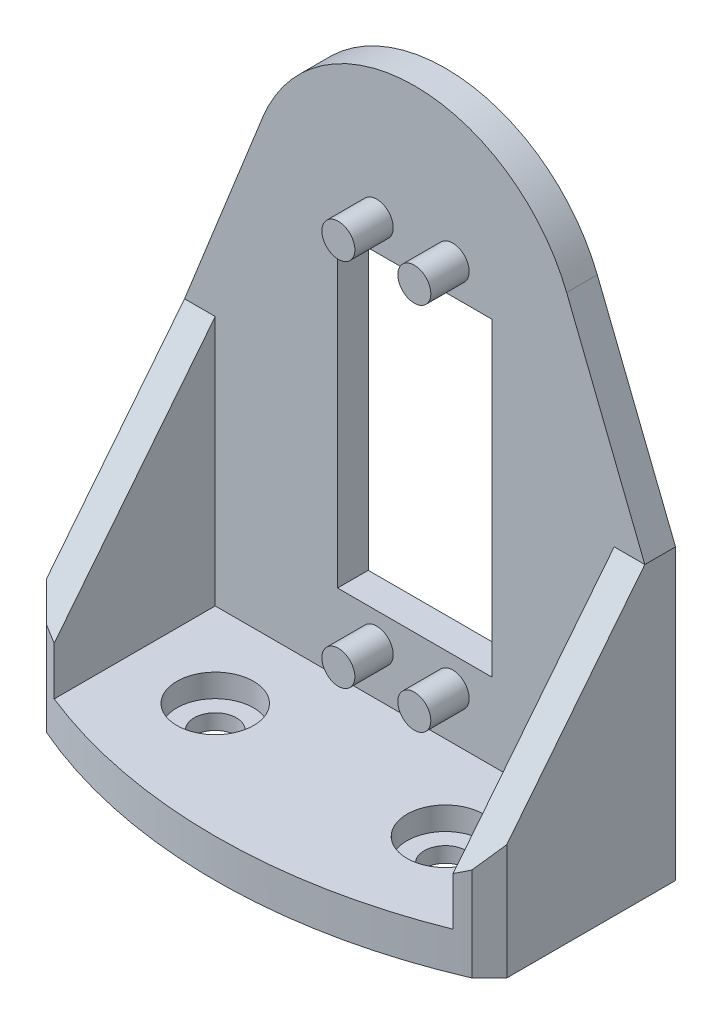
ISO-10303-21;
HEADER;
FILE_DESCRIPTION(('STEP AP214'),'2;1');
FILE_NAME('part.step','',(''),(''),'','','');
FILE_SCHEMA(('AUTOMOTIVE_DESIGN { 1 0 10303 214 1 1 1 1 }'));
ENDSEC;
DATA;
#1=APPLICATION_CONTEXT('core data for automotive mechanical design processes');
#2=APPLICATION_PROTOCOL_DEFINITION('international standard','automotive_design',2000,#1);
#3=PRODUCT_CONTEXT('',#1,'mechanical');
#4=PRODUCT('Part','Part','',(#3));
#5=PRODUCT_RELATED_PRODUCT_CATEGORY('part','',(#4));
#6=PRODUCT_DEFINITION_FORMATION('','',#4);
#7=PRODUCT_DEFINITION_CONTEXT('part definition',#1,'design');
#8=PRODUCT_DEFINITION('design','',#6,#7);
#9=PRODUCT_DEFINITION_SHAPE('','',#8);
#10=(LENGTH_UNIT() NAMED_UNIT(*) SI_UNIT(.MILLI.,.METRE.));
#11=(NAMED_UNIT(*) PLANE_ANGLE_UNIT() SI_UNIT($,.RADIAN.));
#12=(NAMED_UNIT(*) SI_UNIT($,.STERADIAN.) SOLID_ANGLE_UNIT());
#13=UNCERTAINTY_MEASURE_WITH_UNIT(LENGTH_MEASURE(1.E-05),#10,'distance_accuracy_value','');
#14=(GEOMETRIC_REPRESENTATION_CONTEXT(3) GLOBAL_UNCERTAINTY_ASSIGNED_CONTEXT((#13)) GLOBAL_UNIT_ASSIGNED_CONTEXT((#10,
#11,#12)) REPRESENTATION_CONTEXT('',''));
#15=CARTESIAN_POINT('',(0.,0.,0.));
#16=DIRECTION('',(0.,0.,1.));
#17=DIRECTION('',(1.,0.,0.));
#18=AXIS2_PLACEMENT_3D('',#15,#16,#17);
#19=CARTESIAN_POINT('',(-33.8493725389063,28.283541888855,-121.423885974345));
#20=DIRECTION('',(0.,-1.,0.));
#21=DIRECTION('',(0.,0.,-1.));
#22=AXIS2_PLACEMENT_3D('',#19,#20,#21);
#23=PLANE('',#22);
#24=CARTESIAN_POINT('',(-15.,28.283541888855,15.));
#25=DIRECTION('',(0.,1.,0.));
#26=DIRECTION('',(0.,0.,1.));
#27=AXIS2_PLACEMENT_3D('',#24,#25,#26);
#28=CIRCLE('',#27,5.);
#29=CARTESIAN_POINT('',(-15.,28.283541888855,20.));
#30=VERTEX_POINT('',#29);
#31=EDGE_CURVE('E355',#30,#30,#28,.T.);
#32=ORIENTED_EDGE('',*,*,#31,.F.);
#33=EDGE_LOOP('',(#32));
#34=FACE_BOUND('',#33,.T.);
#35=CARTESIAN_POINT('',(15.,28.283541888855,15.));
#36=DIRECTION('',(0.,1.,0.));
#37=DIRECTION('',(0.,0.,1.));
#38=AXIS2_PLACEMENT_3D('',#35,#36,#37);
#39=CIRCLE('',#38,5.);
#40=CARTESIAN_POINT('',(15.,28.283541888855,20.));
#41=VERTEX_POINT('',#40);
#42=EDGE_CURVE('E354',#41,#41,#39,.T.);
#43=ORIENTED_EDGE('',*,*,#42,.F.);
#44=EDGE_LOOP('',(#43));
#45=FACE_BOUND('',#44,.T.);
#46=CARTESIAN_POINT('',(0.,28.283541888855,-40.));
#47=DIRECTION('',(0.,-1.,0.));
#48=DIRECTION('',(0.,0.,-1.));
#49=AXIS2_PLACEMENT_3D('',#46,#47,#48);
#50=CIRCLE('',#49,70.);
#51=CARTESIAN_POINT('',(26.,28.283541888855,24.9923072370877));
#52=VERTEX_POINT('',#51);
#53=CARTESIAN_POINT('',(-26.,28.283541888855,24.9923072370877));
#54=VERTEX_POINT('',#53);
#55=EDGE_CURVE('E348',#52,#54,#50,.T.);
#56=ORIENTED_EDGE('',*,*,#55,.F.);
#57=DIRECTION('',(0.,0.,1.));
#58=VECTOR('',#57,1.);
#59=CARTESIAN_POINT('',(26.,28.283541888855,-121.423885974345));
#60=LINE('',#59,#58);
#61=CARTESIAN_POINT('',(26.,28.283541888855,4.));
#62=VERTEX_POINT('',#61);
#63=EDGE_CURVE('E202',#62,#52,#60,.T.);
#64=ORIENTED_EDGE('',*,*,#63,.F.);
#65=DIRECTION('',(-1.,0.,0.));
#66=VECTOR('',#65,1.);
#67=CARTESIAN_POINT('',(-33.8493725389063,28.283541888855,3.99999999999998));
#68=LINE('',#67,#66);
#69=CARTESIAN_POINT('',(-26.,28.283541888855,3.99999999999998));
#70=VERTEX_POINT('',#69);
#71=EDGE_CURVE('E208',#62,#70,#68,.T.);
#72=ORIENTED_EDGE('',*,*,#71,.T.);
#73=DIRECTION('',(0.,0.,-1.));
#74=VECTOR('',#73,1.);
#75=CARTESIAN_POINT('',(-26.,28.283541888855,-121.423885974345));
#76=LINE('',#75,#74);
#77=EDGE_CURVE('E281',#54,#70,#76,.T.);
#78=ORIENTED_EDGE('',*,*,#77,.F.);
#79=EDGE_LOOP('',(#56,#64,#72,#78));
#80=FACE_BOUND('',#79,.T.);
#81=ADVANCED_FACE('F45',(#34,#45,#80),#23,.F.);
#82=CARTESIAN_POINT('',(-45.,23.283541888855,0.));
#83=DIRECTION('',(0.,-1.,0.));
#84=DIRECTION('',(1.,0.,0.));
#85=AXIS2_PLACEMENT_3D('',#82,#83,#84);
#86=PLANE('',#85);
#87=CARTESIAN_POINT('',(-15.,23.283541888855,15.));
#88=DIRECTION('',(0.,1.,0.));
#89=DIRECTION('',(0.,0.,1.));
#90=AXIS2_PLACEMENT_3D('',#87,#88,#89);
#91=CIRCLE('',#90,2.75);
#92=CARTESIAN_POINT('',(-15.,23.283541888855,17.75));
#93=VERTEX_POINT('',#92);
#94=EDGE_CURVE('E297',#93,#93,#91,.T.);
#95=ORIENTED_EDGE('',*,*,#94,.T.);
#96=EDGE_LOOP('',(#95));
#97=FACE_BOUND('',#96,.T.);
#98=CARTESIAN_POINT('',(15.,23.283541888855,15.));
#99=DIRECTION('',(0.,1.,0.));
#100=DIRECTION('',(0.,0.,1.));
#101=AXIS2_PLACEMENT_3D('',#98,#99,#100);
#102=CIRCLE('',#101,2.75);
#103=CARTESIAN_POINT('',(15.,23.283541888855,17.75));
#104=VERTEX_POINT('',#103);
#105=EDGE_CURVE('E293',#104,#104,#102,.T.);
#106=ORIENTED_EDGE('',*,*,#105,.T.);
#107=EDGE_LOOP('',(#106));
#108=FACE_BOUND('',#107,.T.);
#109=DIRECTION('',(-0.707106781186549,0.,0.707106781186546));
#110=VECTOR('',#109,1.);
#111=CARTESIAN_POINT('',(3.49999999999982,23.283541888855,48.5));
#112=LINE('',#111,#110);
#113=CARTESIAN_POINT('',(30.,23.283541888855,22.));
#114=VERTEX_POINT('',#113);
#115=CARTESIAN_POINT('',(27.7243331175029,23.283541888855,24.2756668824971));
#116=VERTEX_POINT('',#115);
#117=EDGE_CURVE('E170',#114,#116,#112,.T.);
#118=ORIENTED_EDGE('',*,*,#117,.T.);
#119=CARTESIAN_POINT('',(0.,23.283541888855,-40.));
#120=DIRECTION('',(0.,-1.,0.));
#121=DIRECTION('',(1.,0.,0.));
#122=AXIS2_PLACEMENT_3D('',#119,#120,#121);
#123=CIRCLE('',#122,70.);
#124=CARTESIAN_POINT('',(-27.7243331175029,23.283541888855,24.2756668824971));
#125=VERTEX_POINT('',#124);
#126=EDGE_CURVE('E164',#116,#125,#123,.T.);
#127=ORIENTED_EDGE('',*,*,#126,.T.);
#128=DIRECTION('',(-0.707106781186549,0.,-0.707106781186546));
#129=VECTOR('',#128,1.);
#130=CARTESIAN_POINT('',(-48.5,23.283541888855,3.50000000000005));
#131=LINE('',#130,#129);
#132=CARTESIAN_POINT('',(-30.,23.283541888855,22.));
#133=VERTEX_POINT('',#132);
#134=EDGE_CURVE('E167',#125,#133,#131,.T.);
#135=ORIENTED_EDGE('',*,*,#134,.T.);
#136=DIRECTION('',(0.,0.,-1.));
#137=VECTOR('',#136,1.);
#138=CARTESIAN_POINT('',(-30.,23.283541888855,0.));
#139=LINE('',#138,#137);
#140=CARTESIAN_POINT('',(-30.,23.283541888855,0.));
#141=VERTEX_POINT('',#140);
#142=EDGE_CURVE('E269',#133,#141,#139,.T.);
#143=ORIENTED_EDGE('',*,*,#142,.T.);
#144=DIRECTION('',(1.,0.,0.));
#145=VECTOR('',#144,1.);
#146=CARTESIAN_POINT('',(-45.,23.283541888855,0.));
#147=LINE('',#146,#145);
#148=CARTESIAN_POINT('',(30.,23.283541888855,0.));
#149=VERTEX_POINT('',#148);
#150=EDGE_CURVE('E241',#141,#149,#147,.T.);
#151=ORIENTED_EDGE('',*,*,#150,.T.);
#152=DIRECTION('',(0.,0.,1.));
#153=VECTOR('',#152,1.);
#154=CARTESIAN_POINT('',(30.,23.283541888855,0.));
#155=LINE('',#154,#153);
#156=EDGE_CURVE('E279',#149,#114,#155,.T.);
#157=ORIENTED_EDGE('',*,*,#156,.T.);
#158=EDGE_LOOP('',(#118,#127,#135,#143,#151,#157));
#159=FACE_BOUND('',#158,.T.);
#160=ADVANCED_FACE('F165',(#97,#108,#159),#86,.T.);
#161=CARTESIAN_POINT('',(-30.,60.9599104503649,4.));
#162=DIRECTION('',(0.,-0.622632595222004,-0.782514313841678));
#163=DIRECTION('',(0.,-0.782514313841678,0.622632595222004));
#164=AXIS2_PLACEMENT_3D('',#161,#162,#163);
#165=PLANE('',#164);
#166=DIRECTION('',(-0.528552999557653,0.664276639147591,-0.52855299955765));
#167=VECTOR('',#166,1.);
#168=CARTESIAN_POINT('',(-42.971371079855,54.6400130675292,9.02862892014505));
#169=LINE('',#168,#167);
#170=CARTESIAN_POINT('',(-30.,38.3378091385504,22.));
#171=VERTEX_POINT('',#170);
#172=CARTESIAN_POINT('',(-27.7243331175029,35.477788762562,24.2756668824971));
#173=VERTEX_POINT('',#172);
#174=EDGE_CURVE('E54',#171,#173,#169,.F.);
#175=ORIENTED_EDGE('',*,*,#174,.T.);
#176=CARTESIAN_POINT('',(0.,116.258380323689,-40.));
#177=DIRECTION('',(0.,-0.622632595222004,-0.782514313841678));
#178=DIRECTION('',(0.,-0.782514313841678,0.622632595222004));
#179=AXIS2_PLACEMENT_3D('',#176,#177,#178);
#180=ELLIPSE('',#179,112.425851998707,70.);
#181=CARTESIAN_POINT('',(-26.,34.5771270566907,24.9923072370877));
#182=VERTEX_POINT('',#181);
#183=EDGE_CURVE('E61',#173,#182,#180,.F.);
#184=ORIENTED_EDGE('',*,*,#183,.T.);
#185=DIRECTION('',(0.,-0.782514313841678,0.622632595222004));
#186=VECTOR('',#185,1.);
#187=CARTESIAN_POINT('',(-26.,60.9599104503649,4.));
#188=LINE('',#187,#186);
#189=CARTESIAN_POINT('',(-26.,60.9599104503649,4.));
#190=VERTEX_POINT('',#189);
#191=EDGE_CURVE('E198',#190,#182,#188,.T.);
#192=ORIENTED_EDGE('',*,*,#191,.F.);
#193=DIRECTION('',(1.,0.,0.));
#194=VECTOR('',#193,1.);
#195=CARTESIAN_POINT('',(-60.,60.9599104503649,4.));
#196=LINE('',#195,#194);
#197=CARTESIAN_POINT('',(-30.,60.9599104503649,4.));
#198=VERTEX_POINT('',#197);
#199=EDGE_CURVE('E194',#190,#198,#196,.F.);
#200=ORIENTED_EDGE('',*,*,#199,.T.);
#201=DIRECTION('',(0.,-0.782514313841678,0.622632595222004));
#202=VECTOR('',#201,1.);
#203=CARTESIAN_POINT('',(-30.,60.9599104503649,4.));
#204=LINE('',#203,#202);
#205=EDGE_CURVE('E193',#198,#171,#204,.T.);
#206=ORIENTED_EDGE('',*,*,#205,.T.);
#207=EDGE_LOOP('',(#175,#184,#192,#200,#206));
#208=FACE_BOUND('',#207,.T.);
#209=ADVANCED_FACE('F188',(#208),#165,.F.);
#210=CARTESIAN_POINT('',(-26.,61.6417709444275,15.));
#211=DIRECTION('',(-1.,0.,0.));
#212=DIRECTION('',(0.,-1.,0.));
#213=AXIS2_PLACEMENT_3D('',#210,#211,#212);
#214=PLANE('',#213);
#215=DIRECTION('',(0.,-1.,0.));
#216=VECTOR('',#215,1.);
#217=CARTESIAN_POINT('',(-26.,100.,24.9923072370877));
#218=LINE('',#217,#216);
#219=EDGE_CURVE('E346',#54,#182,#218,.F.);
#220=ORIENTED_EDGE('',*,*,#219,.F.);
#221=ORIENTED_EDGE('',*,*,#77,.T.);
#222=DIRECTION('',(0.,-1.,0.));
#223=VECTOR('',#222,1.);
#224=CARTESIAN_POINT('',(-26.,100.,4.));
#225=LINE('',#224,#223);
#226=EDGE_CURVE('E197',#190,#70,#225,.T.);
#227=ORIENTED_EDGE('',*,*,#226,.F.);
#228=ORIENTED_EDGE('',*,*,#191,.T.);
#229=EDGE_LOOP('',(#220,#221,#227,#228));
#230=FACE_BOUND('',#229,.T.);
#231=ADVANCED_FACE('F487',(#230),#214,.F.);
#232=CARTESIAN_POINT('',(26.,61.6417709444275,15.));
#233=DIRECTION('',(1.,0.,0.));
#234=DIRECTION('',(0.,1.,0.));
#235=AXIS2_PLACEMENT_3D('',#232,#233,#234);
#236=PLANE('',#235);
#237=DIRECTION('',(0.,-1.,0.));
#238=VECTOR('',#237,1.);
#239=CARTESIAN_POINT('',(26.,100.,24.9923072370877));
#240=LINE('',#239,#238);
#241=CARTESIAN_POINT('',(26.,34.5771270566907,24.9923072370877));
#242=VERTEX_POINT('',#241);
#243=EDGE_CURVE('E344',#242,#52,#240,.T.);
#244=ORIENTED_EDGE('',*,*,#243,.F.);
#245=DIRECTION('',(0.,-0.782514313841679,0.622632595222003));
#246=VECTOR('',#245,1.);
#247=CARTESIAN_POINT('',(26.,60.959910450365,4.));
#248=LINE('',#247,#246);
#249=CARTESIAN_POINT('',(26.,60.959910450365,4.));
#250=VERTEX_POINT('',#249);
#251=EDGE_CURVE('E329',#250,#242,#248,.T.);
#252=ORIENTED_EDGE('',*,*,#251,.F.);
#253=DIRECTION('',(0.,1.,0.));
#254=VECTOR('',#253,1.);
#255=CARTESIAN_POINT('',(26.,100.,4.));
#256=LINE('',#255,#254);
#257=EDGE_CURVE('E283',#62,#250,#256,.T.);
#258=ORIENTED_EDGE('',*,*,#257,.F.);
#259=ORIENTED_EDGE('',*,*,#63,.T.);
#260=EDGE_LOOP('',(#244,#252,#258,#259));
#261=FACE_BOUND('',#260,.T.);
#262=ADVANCED_FACE('F341',(#261),#236,.F.);
#263=CARTESIAN_POINT('',(30.,60.959910450365,4.));
#264=DIRECTION('',(0.,0.622632595222003,0.782514313841679));
#265=DIRECTION('',(0.,-0.782514313841679,0.622632595222003));
#266=AXIS2_PLACEMENT_3D('',#263,#264,#265);
#267=PLANE('',#266);
#268=ORIENTED_EDGE('',*,*,#251,.T.);
#269=CARTESIAN_POINT('',(0.,116.25838032369,-40.));
#270=DIRECTION('',(0.,0.622632595222003,0.782514313841679));
#271=DIRECTION('',(0.,-0.782514313841679,0.622632595222003));
#272=AXIS2_PLACEMENT_3D('',#269,#270,#271);
#273=ELLIPSE('',#272,112.425851998707,70.);
#274=CARTESIAN_POINT('',(27.7243331175029,35.477788762562,24.2756668824971));
#275=VERTEX_POINT('',#274);
#276=EDGE_CURVE('E336',#242,#275,#273,.T.);
#277=ORIENTED_EDGE('',*,*,#276,.T.);
#278=DIRECTION('',(0.528552999557652,0.664276639147592,-0.52855299955765));
#279=VECTOR('',#278,1.);
#280=CARTESIAN_POINT('',(42.971371079855,54.6400130675293,9.02862892014504));
#281=LINE('',#280,#279);
#282=CARTESIAN_POINT('',(30.,38.3378091385504,22.));
#283=VERTEX_POINT('',#282);
#284=EDGE_CURVE('E178',#275,#283,#281,.T.);
#285=ORIENTED_EDGE('',*,*,#284,.T.);
#286=DIRECTION('',(0.,-0.782514313841679,0.622632595222003));
#287=VECTOR('',#286,1.);
#288=CARTESIAN_POINT('',(30.,60.959910450365,4.));
#289=LINE('',#288,#287);
#290=CARTESIAN_POINT('',(30.,60.959910450365,4.));
#291=VERTEX_POINT('',#290);
#292=EDGE_CURVE('E330',#291,#283,#289,.T.);
#293=ORIENTED_EDGE('',*,*,#292,.F.);
#294=DIRECTION('',(-1.,0.,0.));
#295=VECTOR('',#294,1.);
#296=CARTESIAN_POINT('',(-60.,60.959910450365,4.));
#297=LINE('',#296,#295);
#298=EDGE_CURVE('E181',#291,#250,#297,.T.);
#299=ORIENTED_EDGE('',*,*,#298,.T.);
#300=EDGE_LOOP('',(#268,#277,#285,#293,#299));
#301=FACE_BOUND('',#300,.T.);
#302=ADVANCED_FACE('F335',(#301),#267,.T.);
#303=CARTESIAN_POINT('',(30.,147.336146250847,22.));
#304=DIRECTION('',(0.707106781186546,0.,0.707106781186549));
#305=DIRECTION('',(0.,1.,0.));
#306=AXIS2_PLACEMENT_3D('',#303,#304,#305);
#307=PLANE('',#306);
#308=ORIENTED_EDGE('',*,*,#284,.F.);
#309=DIRECTION('',(0.,-1.,0.));
#310=VECTOR('',#309,1.);
#311=CARTESIAN_POINT('',(27.7243331175028,100.,24.2756668824971));
#312=LINE('',#311,#310);
#313=EDGE_CURVE('E172',#275,#116,#312,.T.);
#314=ORIENTED_EDGE('',*,*,#313,.T.);
#315=ORIENTED_EDGE('',*,*,#117,.F.);
#316=DIRECTION('',(0.,-1.,0.));
#317=VECTOR('',#316,1.);
#318=CARTESIAN_POINT('',(30.,23.283541888855,22.));
#319=LINE('',#318,#317);
#320=EDGE_CURVE('E176',#283,#114,#319,.T.);
#321=ORIENTED_EDGE('',*,*,#320,.F.);
#322=EDGE_LOOP('',(#308,#314,#315,#321));
#323=FACE_BOUND('',#322,.T.);
#324=ADVANCED_FACE('F433',(#323),#307,.T.);
#325=CARTESIAN_POINT('',(-30.,147.336146250847,22.));
#326=DIRECTION('',(-0.707106781186546,0.,0.707106781186549));
#327=DIRECTION('',(0.,-1.,0.));
#328=AXIS2_PLACEMENT_3D('',#325,#326,#327);
#329=PLANE('',#328);
#330=ORIENTED_EDGE('',*,*,#134,.F.);
#331=DIRECTION('',(0.,-1.,0.));
#332=VECTOR('',#331,1.);
#333=CARTESIAN_POINT('',(-27.7243331175029,100.,24.2756668824971));
#334=LINE('',#333,#332);
#335=EDGE_CURVE('E13',#125,#173,#334,.F.);
#336=ORIENTED_EDGE('',*,*,#335,.T.);
#337=ORIENTED_EDGE('',*,*,#174,.F.);
#338=DIRECTION('',(0.,1.,0.));
#339=VECTOR('',#338,1.);
#340=CARTESIAN_POINT('',(-30.,28.283541888855,22.));
#341=LINE('',#340,#339);
#342=EDGE_CURVE('E175',#133,#171,#341,.T.);
#343=ORIENTED_EDGE('',*,*,#342,.F.);
#344=EDGE_LOOP('',(#330,#336,#337,#343));
#345=FACE_BOUND('',#344,.T.);
#346=ADVANCED_FACE('F48',(#345),#329,.T.);
#347=CARTESIAN_POINT('',(-45.,23.283541888855,0.));
#348=DIRECTION('',(-0.929075360655338,0.369890489500816,0.));
#349=DIRECTION('',(-0.369890489500816,-0.929075360655338,0.));
#350=AXIS2_PLACEMENT_3D('',#347,#348,#349);
#351=PLANE('',#350);
#352=DIRECTION('',(-0.369890489500816,-0.929075360655338,0.));
#353=VECTOR('',#352,1.);
#354=CARTESIAN_POINT('',(-45.,23.283541888855,0.));
#355=LINE('',#354,#353);
#356=CARTESIAN_POINT('',(-19.8045960075064,86.5682970140101,0.));
#357=VERTEX_POINT('',#356);
#358=CARTESIAN_POINT('',(-30.,60.9599104503649,0.));
#359=VERTEX_POINT('',#358);
#360=EDGE_CURVE('E239',#357,#359,#355,.T.);
#361=ORIENTED_EDGE('',*,*,#360,.T.);
#362=DIRECTION('',(0.,0.,1.));
#363=VECTOR('',#362,1.);
#364=CARTESIAN_POINT('',(-30.,60.9599104503649,0.));
#365=LINE('',#364,#363);
#366=EDGE_CURVE('E234',#359,#198,#365,.T.);
#367=ORIENTED_EDGE('',*,*,#366,.T.);
#368=DIRECTION('',(0.369890489500816,0.929075360655338,0.));
#369=VECTOR('',#368,1.);
#370=CARTESIAN_POINT('',(-45.,23.283541888855,4.));
#371=LINE('',#370,#369);
#372=CARTESIAN_POINT('',(-19.8045960075064,86.5682970140101,4.));
#373=VERTEX_POINT('',#372);
#374=EDGE_CURVE('E217',#198,#373,#371,.T.);
#375=ORIENTED_EDGE('',*,*,#374,.T.);
#376=DIRECTION('',(0.,0.,1.));
#377=VECTOR('',#376,1.);
#378=CARTESIAN_POINT('',(-19.8045960075064,86.5682970140101,0.));
#379=LINE('',#378,#377);
#380=EDGE_CURVE('E248',#357,#373,#379,.T.);
#381=ORIENTED_EDGE('',*,*,#380,.F.);
#382=EDGE_LOOP('',(#361,#367,#375,#381));
#383=FACE_BOUND('',#382,.T.);
#384=ADVANCED_FACE('F410',(#383),#351,.T.);
#385=CARTESIAN_POINT('',(45.,23.283541888855,0.));
#386=DIRECTION('',(0.929075360655338,0.369890489500817,0.));
#387=DIRECTION('',(-0.369890489500817,0.929075360655338,0.));
#388=AXIS2_PLACEMENT_3D('',#385,#386,#387);
#389=PLANE('',#388);
#390=DIRECTION('',(0.369890489500817,-0.929075360655338,0.));
#391=VECTOR('',#390,1.);
#392=CARTESIAN_POINT('',(45.,23.283541888855,4.));
#393=LINE('',#392,#391);
#394=CARTESIAN_POINT('',(19.8045960075064,86.5682970140101,4.));
#395=VERTEX_POINT('',#394);
#396=EDGE_CURVE('E211',#395,#291,#393,.T.);
#397=ORIENTED_EDGE('',*,*,#396,.T.);
#398=DIRECTION('',(0.,0.,-1.));
#399=VECTOR('',#398,1.);
#400=CARTESIAN_POINT('',(30.,60.9599104503649,0.));
#401=LINE('',#400,#399);
#402=CARTESIAN_POINT('',(30.,60.9599104503649,0.));
#403=VERTEX_POINT('',#402);
#404=EDGE_CURVE('E237',#291,#403,#401,.T.);
#405=ORIENTED_EDGE('',*,*,#404,.T.);
#406=DIRECTION('',(-0.369890489500817,0.929075360655338,0.));
#407=VECTOR('',#406,1.);
#408=CARTESIAN_POINT('',(45.,23.283541888855,0.));
#409=LINE('',#408,#407);
#410=CARTESIAN_POINT('',(19.8045960075064,86.5682970140101,0.));
#411=VERTEX_POINT('',#410);
#412=EDGE_CURVE('E243',#403,#411,#409,.T.);
#413=ORIENTED_EDGE('',*,*,#412,.T.);
#414=DIRECTION('',(0.,0.,1.));
#415=VECTOR('',#414,1.);
#416=CARTESIAN_POINT('',(19.8045960075064,86.5682970140101,0.));
#417=LINE('',#416,#415);
#418=EDGE_CURVE('E247',#411,#395,#417,.T.);
#419=ORIENTED_EDGE('',*,*,#418,.T.);
#420=EDGE_LOOP('',(#397,#405,#413,#419));
#421=FACE_BOUND('',#420,.T.);
#422=ADVANCED_FACE('F407',(#421),#389,.T.);
#423=CARTESIAN_POINT('',(-10.05,78.683541888855,0.));
#424=DIRECTION('',(0.,1.,0.));
#425=DIRECTION('',(0.,0.,1.));
#426=AXIS2_PLACEMENT_3D('',#423,#424,#425);
#427=PLANE('',#426);
#428=DIRECTION('',(1.,0.,0.));
#429=VECTOR('',#428,1.);
#430=CARTESIAN_POINT('',(-10.05,78.683541888855,4.));
#431=LINE('',#430,#429);
#432=CARTESIAN_POINT('',(-10.05,78.683541888855,4.));
#433=VERTEX_POINT('',#432);
#434=CARTESIAN_POINT('',(10.05,78.683541888855,4.));
#435=VERTEX_POINT('',#434);
#436=EDGE_CURVE('E226',#433,#435,#431,.T.);
#437=ORIENTED_EDGE('',*,*,#436,.F.);
#438=DIRECTION('',(0.,0.,1.));
#439=VECTOR('',#438,1.);
#440=CARTESIAN_POINT('',(-10.05,78.683541888855,0.));
#441=LINE('',#440,#439);
#442=CARTESIAN_POINT('',(-10.05,78.683541888855,0.));
#443=VERTEX_POINT('',#442);
#444=EDGE_CURVE('E265',#443,#433,#441,.T.);
#445=ORIENTED_EDGE('',*,*,#444,.F.);
#446=DIRECTION('',(-1.,0.,0.));
#447=VECTOR('',#446,1.);
#448=CARTESIAN_POINT('',(-10.05,78.683541888855,0.));
#449=LINE('',#448,#447);
#450=CARTESIAN_POINT('',(10.05,78.683541888855,0.));
#451=VERTEX_POINT('',#450);
#452=EDGE_CURVE('E251',#451,#443,#449,.T.);
#453=ORIENTED_EDGE('',*,*,#452,.F.);
#454=DIRECTION('',(0.,0.,1.));
#455=VECTOR('',#454,1.);
#456=CARTESIAN_POINT('',(10.05,78.683541888855,0.));
#457=LINE('',#456,#455);
#458=EDGE_CURVE('E266',#451,#435,#457,.T.);
#459=ORIENTED_EDGE('',*,*,#458,.T.);
#460=EDGE_LOOP('',(#437,#445,#453,#459));
#461=FACE_BOUND('',#460,.T.);
#462=ADVANCED_FACE('F409',(#461),#427,.F.);
#463=CARTESIAN_POINT('',(10.05,78.683541888855,0.));
#464=DIRECTION('',(1.,0.,0.));
#465=DIRECTION('',(0.,1.,0.));
#466=AXIS2_PLACEMENT_3D('',#463,#464,#465);
#467=PLANE('',#466);
#468=DIRECTION('',(0.,-1.,0.));
#469=VECTOR('',#468,1.);
#470=CARTESIAN_POINT('',(10.05,78.683541888855,4.));
#471=LINE('',#470,#469);
#472=CARTESIAN_POINT('',(10.05,38.283541888855,4.));
#473=VERTEX_POINT('',#472);
#474=EDGE_CURVE('E224',#435,#473,#471,.T.);
#475=ORIENTED_EDGE('',*,*,#474,.F.);
#476=ORIENTED_EDGE('',*,*,#458,.F.);
#477=DIRECTION('',(0.,1.,0.));
#478=VECTOR('',#477,1.);
#479=CARTESIAN_POINT('',(10.05,78.683541888855,0.));
#480=LINE('',#479,#478);
#481=CARTESIAN_POINT('',(10.05,38.283541888855,0.));
#482=VERTEX_POINT('',#481);
#483=EDGE_CURVE('E262',#482,#451,#480,.T.);
#484=ORIENTED_EDGE('',*,*,#483,.F.);
#485=DIRECTION('',(0.,0.,1.));
#486=VECTOR('',#485,1.);
#487=CARTESIAN_POINT('',(10.05,38.283541888855,0.));
#488=LINE('',#487,#486);
#489=EDGE_CURVE('E270',#482,#473,#488,.T.);
#490=ORIENTED_EDGE('',*,*,#489,.T.);
#491=EDGE_LOOP('',(#475,#476,#484,#490));
#492=FACE_BOUND('',#491,.T.);
#493=ADVANCED_FACE('F416',(#492),#467,.F.);
#494=CARTESIAN_POINT('',(-10.05,38.283541888855,0.));
#495=DIRECTION('',(0.,-1.,0.));
#496=DIRECTION('',(1.,0.,0.));
#497=AXIS2_PLACEMENT_3D('',#494,#495,#496);
#498=PLANE('',#497);
#499=DIRECTION('',(-1.,0.,0.));
#500=VECTOR('',#499,1.);
#501=CARTESIAN_POINT('',(-10.05,38.283541888855,4.));
#502=LINE('',#501,#500);
#503=CARTESIAN_POINT('',(-10.05,38.283541888855,4.));
#504=VERTEX_POINT('',#503);
#505=EDGE_CURVE('E222',#473,#504,#502,.T.);
#506=ORIENTED_EDGE('',*,*,#505,.F.);
#507=ORIENTED_EDGE('',*,*,#489,.F.);
#508=DIRECTION('',(1.,0.,0.));
#509=VECTOR('',#508,1.);
#510=CARTESIAN_POINT('',(-10.05,38.283541888855,0.));
#511=LINE('',#510,#509);
#512=CARTESIAN_POINT('',(-10.05,38.283541888855,0.));
#513=VERTEX_POINT('',#512);
#514=EDGE_CURVE('E259',#513,#482,#511,.T.);
#515=ORIENTED_EDGE('',*,*,#514,.F.);
#516=DIRECTION('',(0.,0.,1.));
#517=VECTOR('',#516,1.);
#518=CARTESIAN_POINT('',(-10.05,38.283541888855,0.));
#519=LINE('',#518,#517);
#520=EDGE_CURVE('E273',#513,#504,#519,.T.);
#521=ORIENTED_EDGE('',*,*,#520,.T.);
#522=EDGE_LOOP('',(#506,#507,#515,#521));
#523=FACE_BOUND('',#522,.T.);
#524=ADVANCED_FACE('F419',(#523),#498,.F.);
#525=CARTESIAN_POINT('',(-10.05,78.683541888855,0.));
#526=DIRECTION('',(-1.,0.,0.));
#527=DIRECTION('',(0.,-1.,0.));
#528=AXIS2_PLACEMENT_3D('',#525,#526,#527);
#529=PLANE('',#528);
#530=DIRECTION('',(0.,1.,0.));
#531=VECTOR('',#530,1.);
#532=CARTESIAN_POINT('',(-10.05,78.683541888855,4.));
#533=LINE('',#532,#531);
#534=EDGE_CURVE('E220',#504,#433,#533,.T.);
#535=ORIENTED_EDGE('',*,*,#534,.F.);
#536=ORIENTED_EDGE('',*,*,#520,.F.);
#537=DIRECTION('',(0.,-1.,0.));
#538=VECTOR('',#537,1.);
#539=CARTESIAN_POINT('',(-10.05,78.683541888855,0.));
#540=LINE('',#539,#538);
#541=EDGE_CURVE('E256',#443,#513,#540,.T.);
#542=ORIENTED_EDGE('',*,*,#541,.F.);
#543=ORIENTED_EDGE('',*,*,#444,.T.);
#544=EDGE_LOOP('',(#535,#536,#542,#543));
#545=FACE_BOUND('',#544,.T.);
#546=ADVANCED_FACE('F405',(#545),#529,.F.);
#547=CARTESIAN_POINT('',(0.,78.683541888855,0.));
#548=DIRECTION('',(0.,0.,1.));
#549=DIRECTION('',(1.,0.,0.));
#550=AXIS2_PLACEMENT_3D('',#547,#548,#549);
#551=CYLINDRICAL_SURFACE('',#550,21.316458111145);
#552=ORIENTED_EDGE('',*,*,#380,.T.);
#553=CARTESIAN_POINT('',(0.,78.683541888855,4.));
#554=DIRECTION('',(0.,0.,1.));
#555=DIRECTION('',(1.,0.,0.));
#556=AXIS2_PLACEMENT_3D('',#553,#554,#555);
#557=CIRCLE('',#556,21.316458111145);
#558=EDGE_CURVE('E214',#373,#395,#557,.F.);
#559=ORIENTED_EDGE('',*,*,#558,.T.);
#560=ORIENTED_EDGE('',*,*,#418,.F.);
#561=CARTESIAN_POINT('',(0.,78.683541888855,0.));
#562=DIRECTION('',(0.,0.,1.));
#563=DIRECTION('',(1.,0.,0.));
#564=AXIS2_PLACEMENT_3D('',#561,#562,#563);
#565=CIRCLE('',#564,21.316458111145);
#566=EDGE_CURVE('E245',#411,#357,#565,.T.);
#567=ORIENTED_EDGE('',*,*,#566,.T.);
#568=EDGE_LOOP('',(#552,#559,#560,#567));
#569=FACE_BOUND('',#568,.T.);
#570=ADVANCED_FACE('F402',(#569),#551,.T.);
#571=CARTESIAN_POINT('',(-60.,100.,0.));
#572=DIRECTION('',(0.,0.,1.));
#573=DIRECTION('',(1.,0.,0.));
#574=AXIS2_PLACEMENT_3D('',#571,#572,#573);
#575=PLANE('',#574);
#576=ORIENTED_EDGE('',*,*,#566,.F.);
#577=ORIENTED_EDGE('',*,*,#412,.F.);
#578=DIRECTION('',(0.,1.,0.));
#579=VECTOR('',#578,1.);
#580=CARTESIAN_POINT('',(30.,147.336146250847,0.));
#581=LINE('',#580,#579);
#582=EDGE_CURVE('E228',#149,#403,#581,.T.);
#583=ORIENTED_EDGE('',*,*,#582,.F.);
#584=ORIENTED_EDGE('',*,*,#150,.F.);
#585=DIRECTION('',(0.,-1.,0.));
#586=VECTOR('',#585,1.);
#587=CARTESIAN_POINT('',(-30.,147.336146250847,0.));
#588=LINE('',#587,#586);
#589=EDGE_CURVE('E231',#359,#141,#588,.T.);
#590=ORIENTED_EDGE('',*,*,#589,.F.);
#591=ORIENTED_EDGE('',*,*,#360,.F.);
#592=EDGE_LOOP('',(#576,#577,#583,#584,#590,#591));
#593=FACE_BOUND('',#592,.T.);
#594=ORIENTED_EDGE('',*,*,#483,.T.);
#595=ORIENTED_EDGE('',*,*,#452,.T.);
#596=ORIENTED_EDGE('',*,*,#541,.T.);
#597=ORIENTED_EDGE('',*,*,#514,.T.);
#598=EDGE_LOOP('',(#594,#595,#596,#597));
#599=FACE_BOUND('',#598,.T.);
#600=ADVANCED_FACE('F398',(#593,#599),#575,.F.);
#601=CARTESIAN_POINT('',(-30.,147.336146250847,0.));
#602=DIRECTION('',(-1.,0.,0.));
#603=DIRECTION('',(0.,-1.,0.));
#604=AXIS2_PLACEMENT_3D('',#601,#602,#603);
#605=PLANE('',#604);
#606=ORIENTED_EDGE('',*,*,#142,.F.);
#607=ORIENTED_EDGE('',*,*,#342,.T.);
#608=ORIENTED_EDGE('',*,*,#205,.F.);
#609=ORIENTED_EDGE('',*,*,#366,.F.);
#610=ORIENTED_EDGE('',*,*,#589,.T.);
#611=EDGE_LOOP('',(#606,#607,#608,#609,#610));
#612=FACE_BOUND('',#611,.T.);
#613=ADVANCED_FACE('F394',(#612),#605,.T.);
#614=CARTESIAN_POINT('',(30.,147.336146250847,0.));
#615=DIRECTION('',(1.,0.,0.));
#616=DIRECTION('',(0.,1.,0.));
#617=AXIS2_PLACEMENT_3D('',#614,#615,#616);
#618=PLANE('',#617);
#619=ORIENTED_EDGE('',*,*,#292,.T.);
#620=ORIENTED_EDGE('',*,*,#320,.T.);
#621=ORIENTED_EDGE('',*,*,#156,.F.);
#622=ORIENTED_EDGE('',*,*,#582,.T.);
#623=ORIENTED_EDGE('',*,*,#404,.F.);
#624=EDGE_LOOP('',(#619,#620,#621,#622,#623));
#625=FACE_BOUND('',#624,.T.);
#626=ADVANCED_FACE('F397',(#625),#618,.T.);
#627=CARTESIAN_POINT('',(-60.,100.,4.));
#628=DIRECTION('',(0.,0.,1.));
#629=DIRECTION('',(1.,0.,0.));
#630=AXIS2_PLACEMENT_3D('',#627,#628,#629);
#631=PLANE('',#630);
#632=ORIENTED_EDGE('',*,*,#298,.F.);
#633=ORIENTED_EDGE('',*,*,#396,.F.);
#634=ORIENTED_EDGE('',*,*,#558,.F.);
#635=ORIENTED_EDGE('',*,*,#374,.F.);
#636=ORIENTED_EDGE('',*,*,#199,.F.);
#637=ORIENTED_EDGE('',*,*,#226,.T.);
#638=ORIENTED_EDGE('',*,*,#71,.F.);
#639=ORIENTED_EDGE('',*,*,#257,.T.);
#640=EDGE_LOOP('',(#632,#633,#634,#635,#636,#637,#638,#639));
#641=FACE_BOUND('',#640,.T.);
#642=CARTESIAN_POINT('',(4.95,34.383541888855,4.));
#643=DIRECTION('',(0.,0.,1.));
#644=DIRECTION('',(1.,0.,0.));
#645=AXIS2_PLACEMENT_3D('',#642,#643,#644);
#646=CIRCLE('',#645,2.15);
#647=CARTESIAN_POINT('',(7.1,34.383541888855,4.));
#648=VERTEX_POINT('',#647);
#649=EDGE_CURVE('E308',#648,#648,#646,.T.);
#650=ORIENTED_EDGE('',*,*,#649,.F.);
#651=EDGE_LOOP('',(#650));
#652=FACE_BOUND('',#651,.T.);
#653=CARTESIAN_POINT('',(-4.95,34.383541888855,4.));
#654=DIRECTION('',(0.,0.,1.));
#655=DIRECTION('',(1.,0.,0.));
#656=AXIS2_PLACEMENT_3D('',#653,#654,#655);
#657=CIRCLE('',#656,2.15);
#658=CARTESIAN_POINT('',(-2.8,34.383541888855,4.));
#659=VERTEX_POINT('',#658);
#660=EDGE_CURVE('E314',#659,#659,#657,.T.);
#661=ORIENTED_EDGE('',*,*,#660,.F.);
#662=EDGE_LOOP('',(#661));
#663=FACE_BOUND('',#662,.T.);
#664=CARTESIAN_POINT('',(4.95,82.583541888855,4.));
#665=DIRECTION('',(0.,0.,1.));
#666=DIRECTION('',(1.,0.,0.));
#667=AXIS2_PLACEMENT_3D('',#664,#665,#666);
#668=CIRCLE('',#667,2.15);
#669=CARTESIAN_POINT('',(7.1,82.583541888855,4.));
#670=VERTEX_POINT('',#669);
#671=EDGE_CURVE('E320',#670,#670,#668,.T.);
#672=ORIENTED_EDGE('',*,*,#671,.F.);
#673=EDGE_LOOP('',(#672));
#674=FACE_BOUND('',#673,.T.);
#675=ORIENTED_EDGE('',*,*,#436,.T.);
#676=ORIENTED_EDGE('',*,*,#474,.T.);
#677=ORIENTED_EDGE('',*,*,#505,.T.);
#678=ORIENTED_EDGE('',*,*,#534,.T.);
#679=EDGE_LOOP('',(#675,#676,#677,#678));
#680=FACE_BOUND('',#679,.T.);
#681=CARTESIAN_POINT('',(-4.95,82.583541888855,4.));
#682=DIRECTION('',(0.,0.,1.));
#683=DIRECTION('',(1.,0.,0.));
#684=AXIS2_PLACEMENT_3D('',#681,#682,#683);
#685=CIRCLE('',#684,2.15);
#686=CARTESIAN_POINT('',(-2.8,82.583541888855,4.));
#687=VERTEX_POINT('',#686);
#688=EDGE_CURVE('E326',#687,#687,#685,.T.);
#689=ORIENTED_EDGE('',*,*,#688,.F.);
#690=EDGE_LOOP('',(#689));
#691=FACE_BOUND('',#690,.T.);
#692=ADVANCED_FACE('F392',(#641,#652,#663,#674,#680,#691),#631,.T.);
#693=CARTESIAN_POINT('',(-4.95,82.583541888855,9.));
#694=DIRECTION('',(0.,0.,1.));
#695=DIRECTION('',(1.,0.,0.));
#696=AXIS2_PLACEMENT_3D('',#693,#694,#695);
#697=PLANE('',#696);
#698=CARTESIAN_POINT('',(-4.95,82.583541888855,9.));
#699=DIRECTION('',(0.,0.,1.));
#700=DIRECTION('',(1.,0.,0.));
#701=AXIS2_PLACEMENT_3D('',#698,#699,#700);
#702=CIRCLE('',#701,2.15);
#703=CARTESIAN_POINT('',(-2.8,82.583541888855,9.));
#704=VERTEX_POINT('',#703);
#705=EDGE_CURVE('E323',#704,#704,#702,.T.);
#706=ORIENTED_EDGE('',*,*,#705,.T.);
#707=EDGE_LOOP('',(#706));
#708=FACE_BOUND('',#707,.T.);
#709=ADVANCED_FACE('F468',(#708),#697,.T.);
#710=CARTESIAN_POINT('',(-4.95,82.583541888855,-6.0811183182043));
#711=DIRECTION('',(0.,0.,1.));
#712=DIRECTION('',(1.,0.,0.));
#713=AXIS2_PLACEMENT_3D('',#710,#711,#712);
#714=CYLINDRICAL_SURFACE('',#713,2.15);
#715=ORIENTED_EDGE('',*,*,#688,.T.);
#716=EDGE_LOOP('',(#715));
#717=FACE_BOUND('',#716,.T.);
#718=ORIENTED_EDGE('',*,*,#705,.F.);
#719=EDGE_LOOP('',(#718));
#720=FACE_BOUND('',#719,.T.);
#721=ADVANCED_FACE('F471',(#717,#720),#714,.T.);
#722=CARTESIAN_POINT('',(4.95,82.583541888855,9.));
#723=DIRECTION('',(0.,0.,1.));
#724=DIRECTION('',(1.,0.,0.));
#725=AXIS2_PLACEMENT_3D('',#722,#723,#724);
#726=PLANE('',#725);
#727=CARTESIAN_POINT('',(4.95,82.583541888855,9.));
#728=DIRECTION('',(0.,0.,1.));
#729=DIRECTION('',(1.,0.,0.));
#730=AXIS2_PLACEMENT_3D('',#727,#728,#729);
#731=CIRCLE('',#730,2.15);
#732=CARTESIAN_POINT('',(7.1,82.583541888855,9.));
#733=VERTEX_POINT('',#732);
#734=EDGE_CURVE('E317',#733,#733,#731,.T.);
#735=ORIENTED_EDGE('',*,*,#734,.T.);
#736=EDGE_LOOP('',(#735));
#737=FACE_BOUND('',#736,.T.);
#738=ADVANCED_FACE('F474',(#737),#726,.T.);
#739=CARTESIAN_POINT('',(4.95,82.583541888855,-6.0811183182043));
#740=DIRECTION('',(0.,0.,1.));
#741=DIRECTION('',(1.,0.,0.));
#742=AXIS2_PLACEMENT_3D('',#739,#740,#741);
#743=CYLINDRICAL_SURFACE('',#742,2.15);
#744=ORIENTED_EDGE('',*,*,#671,.T.);
#745=EDGE_LOOP('',(#744));
#746=FACE_BOUND('',#745,.T.);
#747=ORIENTED_EDGE('',*,*,#734,.F.);
#748=EDGE_LOOP('',(#747));
#749=FACE_BOUND('',#748,.T.);
#750=ADVANCED_FACE('F483',(#746,#749),#743,.T.);
#751=CARTESIAN_POINT('',(-4.95,34.383541888855,9.));
#752=DIRECTION('',(0.,0.,1.));
#753=DIRECTION('',(1.,0.,0.));
#754=AXIS2_PLACEMENT_3D('',#751,#752,#753);
#755=PLANE('',#754);
#756=CARTESIAN_POINT('',(-4.95,34.383541888855,9.));
#757=DIRECTION('',(0.,0.,1.));
#758=DIRECTION('',(1.,0.,0.));
#759=AXIS2_PLACEMENT_3D('',#756,#757,#758);
#760=CIRCLE('',#759,2.15);
#761=CARTESIAN_POINT('',(-2.8,34.383541888855,9.));
#762=VERTEX_POINT('',#761);
#763=EDGE_CURVE('E311',#762,#762,#760,.T.);
#764=ORIENTED_EDGE('',*,*,#763,.T.);
#765=EDGE_LOOP('',(#764));
#766=FACE_BOUND('',#765,.T.);
#767=ADVANCED_FACE('F631',(#766),#755,.T.);
#768=CARTESIAN_POINT('',(-4.95,34.383541888855,-6.0811183182043));
#769=DIRECTION('',(0.,0.,1.));
#770=DIRECTION('',(1.,0.,0.));
#771=AXIS2_PLACEMENT_3D('',#768,#769,#770);
#772=CYLINDRICAL_SURFACE('',#771,2.15);
#773=ORIENTED_EDGE('',*,*,#660,.T.);
#774=EDGE_LOOP('',(#773));
#775=FACE_BOUND('',#774,.T.);
#776=ORIENTED_EDGE('',*,*,#763,.F.);
#777=EDGE_LOOP('',(#776));
#778=FACE_BOUND('',#777,.T.);
#779=ADVANCED_FACE('F621',(#775,#778),#772,.T.);
#780=CARTESIAN_POINT('',(4.95,34.383541888855,9.));
#781=DIRECTION('',(0.,0.,1.));
#782=DIRECTION('',(1.,0.,0.));
#783=AXIS2_PLACEMENT_3D('',#780,#781,#782);
#784=PLANE('',#783);
#785=CARTESIAN_POINT('',(4.95,34.383541888855,9.));
#786=DIRECTION('',(0.,0.,1.));
#787=DIRECTION('',(1.,0.,0.));
#788=AXIS2_PLACEMENT_3D('',#785,#786,#787);
#789=CIRCLE('',#788,2.15);
#790=CARTESIAN_POINT('',(7.1,34.383541888855,9.));
#791=VERTEX_POINT('',#790);
#792=EDGE_CURVE('E302',#791,#791,#789,.T.);
#793=ORIENTED_EDGE('',*,*,#792,.T.);
#794=EDGE_LOOP('',(#793));
#795=FACE_BOUND('',#794,.T.);
#796=ADVANCED_FACE('F611',(#795),#784,.T.);
#797=CARTESIAN_POINT('',(4.95,34.383541888855,-6.0811183182043));
#798=DIRECTION('',(0.,0.,1.));
#799=DIRECTION('',(1.,0.,0.));
#800=AXIS2_PLACEMENT_3D('',#797,#798,#799);
#801=CYLINDRICAL_SURFACE('',#800,2.15);
#802=ORIENTED_EDGE('',*,*,#649,.T.);
#803=EDGE_LOOP('',(#802));
#804=FACE_BOUND('',#803,.T.);
#805=ORIENTED_EDGE('',*,*,#792,.F.);
#806=EDGE_LOOP('',(#805));
#807=FACE_BOUND('',#806,.T.);
#808=ADVANCED_FACE('F602',(#804,#807),#801,.T.);
#809=CARTESIAN_POINT('',(15.,23.283541888855,15.));
#810=DIRECTION('',(0.,1.,0.));
#811=DIRECTION('',(0.,0.,1.));
#812=AXIS2_PLACEMENT_3D('',#809,#810,#811);
#813=CYLINDRICAL_SURFACE('',#812,2.75);
#814=CARTESIAN_POINT('',(15.,25.283541888855,15.));
#815=DIRECTION('',(0.,-1.,0.));
#816=DIRECTION('',(1.,0.,0.));
#817=AXIS2_PLACEMENT_3D('',#814,#815,#816);
#818=CIRCLE('',#817,2.75);
#819=CARTESIAN_POINT('',(17.75,25.283541888855,15.));
#820=VERTEX_POINT('',#819);
#821=EDGE_CURVE('E290',#820,#820,#818,.F.);
#822=ORIENTED_EDGE('',*,*,#821,.T.);
#823=EDGE_LOOP('',(#822));
#824=FACE_BOUND('',#823,.T.);
#825=ORIENTED_EDGE('',*,*,#105,.F.);
#826=EDGE_LOOP('',(#825));
#827=FACE_BOUND('',#826,.T.);
#828=ADVANCED_FACE('F592',(#824,#827),#813,.F.);
#829=CARTESIAN_POINT('',(-15.,23.283541888855,15.));
#830=DIRECTION('',(0.,1.,0.));
#831=DIRECTION('',(0.,0.,1.));
#832=AXIS2_PLACEMENT_3D('',#829,#830,#831);
#833=CYLINDRICAL_SURFACE('',#832,2.75);
#834=CARTESIAN_POINT('',(-15.,25.283541888855,15.));
#835=DIRECTION('',(0.,-1.,0.));
#836=DIRECTION('',(1.,0.,0.));
#837=AXIS2_PLACEMENT_3D('',#834,#835,#836);
#838=CIRCLE('',#837,2.75);
#839=CARTESIAN_POINT('',(-12.25,25.283541888855,15.));
#840=VERTEX_POINT('',#839);
#841=EDGE_CURVE('E288',#840,#840,#838,.F.);
#842=ORIENTED_EDGE('',*,*,#841,.T.);
#843=EDGE_LOOP('',(#842));
#844=FACE_BOUND('',#843,.T.);
#845=ORIENTED_EDGE('',*,*,#94,.F.);
#846=EDGE_LOOP('',(#845));
#847=FACE_BOUND('',#846,.T.);
#848=ADVANCED_FACE('F583',(#844,#847),#833,.F.);
#849=CARTESIAN_POINT('',(-45.,25.283541888855,0.));
#850=DIRECTION('',(0.,-1.,0.));
#851=DIRECTION('',(1.,0.,0.));
#852=AXIS2_PLACEMENT_3D('',#849,#850,#851);
#853=PLANE('',#852);
#854=CARTESIAN_POINT('',(-15.,25.283541888855,15.));
#855=DIRECTION('',(0.,-1.,0.));
#856=DIRECTION('',(1.,0.,0.));
#857=AXIS2_PLACEMENT_3D('',#854,#855,#856);
#858=CIRCLE('',#857,5.);
#859=CARTESIAN_POINT('',(-10.,25.283541888855,15.));
#860=VERTEX_POINT('',#859);
#861=EDGE_CURVE('E291',#860,#860,#858,.F.);
#862=ORIENTED_EDGE('',*,*,#861,.T.);
#863=EDGE_LOOP('',(#862));
#864=FACE_BOUND('',#863,.T.);
#865=ORIENTED_EDGE('',*,*,#841,.F.);
#866=EDGE_LOOP('',(#865));
#867=FACE_BOUND('',#866,.T.);
#868=ADVANCED_FACE('F573',(#864,#867),#853,.F.);
#869=CARTESIAN_POINT('',(-15.,9.14140626512407,15.));
#870=DIRECTION('',(0.,1.,0.));
#871=DIRECTION('',(0.,0.,1.));
#872=AXIS2_PLACEMENT_3D('',#869,#870,#871);
#873=CYLINDRICAL_SURFACE('',#872,5.);
#874=ORIENTED_EDGE('',*,*,#31,.T.);
#875=EDGE_LOOP('',(#874));
#876=FACE_BOUND('',#875,.T.);
#877=ORIENTED_EDGE('',*,*,#861,.F.);
#878=EDGE_LOOP('',(#877));
#879=FACE_BOUND('',#878,.T.);
#880=ADVANCED_FACE('F377',(#876,#879),#873,.F.);
#881=CARTESIAN_POINT('',(-45.,25.283541888855,0.));
#882=DIRECTION('',(0.,-1.,0.));
#883=DIRECTION('',(1.,0.,0.));
#884=AXIS2_PLACEMENT_3D('',#881,#882,#883);
#885=PLANE('',#884);
#886=CARTESIAN_POINT('',(15.,25.283541888855,15.));
#887=DIRECTION('',(0.,-1.,0.));
#888=DIRECTION('',(1.,0.,0.));
#889=AXIS2_PLACEMENT_3D('',#886,#887,#888);
#890=CIRCLE('',#889,5.);
#891=CARTESIAN_POINT('',(20.,25.283541888855,15.));
#892=VERTEX_POINT('',#891);
#893=EDGE_CURVE('E358',#892,#892,#890,.F.);
#894=ORIENTED_EDGE('',*,*,#893,.T.);
#895=EDGE_LOOP('',(#894));
#896=FACE_BOUND('',#895,.T.);
#897=ORIENTED_EDGE('',*,*,#821,.F.);
#898=EDGE_LOOP('',(#897));
#899=FACE_BOUND('',#898,.T.);
#900=ADVANCED_FACE('F365',(#896,#899),#885,.F.);
#901=CARTESIAN_POINT('',(15.,9.14140626512407,15.));
#902=DIRECTION('',(0.,1.,0.));
#903=DIRECTION('',(0.,0.,1.));
#904=AXIS2_PLACEMENT_3D('',#901,#902,#903);
#905=CYLINDRICAL_SURFACE('',#904,5.);
#906=ORIENTED_EDGE('',*,*,#42,.T.);
#907=EDGE_LOOP('',(#906));
#908=FACE_BOUND('',#907,.T.);
#909=ORIENTED_EDGE('',*,*,#893,.F.);
#910=EDGE_LOOP('',(#909));
#911=FACE_BOUND('',#910,.T.);
#912=ADVANCED_FACE('F368',(#908,#911),#905,.F.);
#913=CARTESIAN_POINT('',(0.,100.,-40.));
#914=DIRECTION('',(0.,-1.,0.));
#915=DIRECTION('',(1.,0.,0.));
#916=AXIS2_PLACEMENT_3D('',#913,#914,#915);
#917=CYLINDRICAL_SURFACE('',#916,70.);
#918=ORIENTED_EDGE('',*,*,#55,.T.);
#919=ORIENTED_EDGE('',*,*,#219,.T.);
#920=ORIENTED_EDGE('',*,*,#183,.F.);
#921=ORIENTED_EDGE('',*,*,#335,.F.);
#922=ORIENTED_EDGE('',*,*,#126,.F.);
#923=ORIENTED_EDGE('',*,*,#313,.F.);
#924=ORIENTED_EDGE('',*,*,#276,.F.);
#925=ORIENTED_EDGE('',*,*,#243,.T.);
#926=EDGE_LOOP('',(#918,#919,#920,#921,#922,#923,#924,#925));
#927=FACE_BOUND('',#926,.T.);
#928=ADVANCED_FACE('F174',(#927),#917,.T.);
#929=CLOSED_SHELL('',(#81,#160,#209,#231,#262,#302,#324,#346,#384,#422,#462,#493,#524,#546,#570,
#600,#613,#626,#692,#709,#721,#738,#750,#767,#779,#796,#808,#828,#848,#868,#880,#900,#912,#928));
#930=MANIFOLD_SOLID_BREP('B2',#929);
#931=ADVANCED_BREP_SHAPE_REPRESENTATION('',(#18,#930),#14);
#932=SHAPE_DEFINITION_REPRESENTATION(#9,#931);
ENDSEC;
END-ISO-10303-21;
